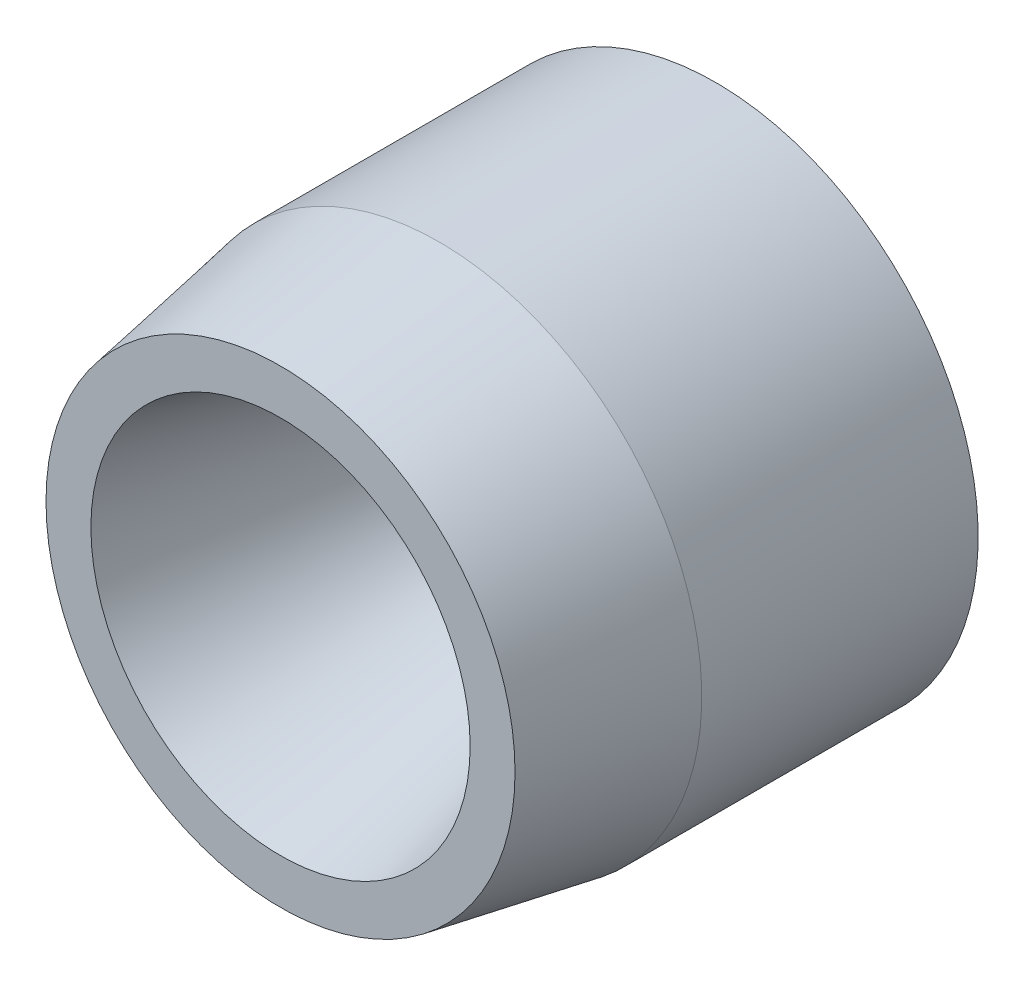
ISO-10303-21;
HEADER;
FILE_DESCRIPTION(('STEP AP214'),'2;1');
FILE_NAME('part.step','',(''),(''),'','','');
FILE_SCHEMA(('AUTOMOTIVE_DESIGN { 1 0 10303 214 1 1 1 1 }'));
ENDSEC;
DATA;
#1=APPLICATION_CONTEXT('core data for automotive mechanical design processes');
#2=APPLICATION_PROTOCOL_DEFINITION('international standard','automotive_design',2000,#1);
#3=PRODUCT_CONTEXT('',#1,'mechanical');
#4=PRODUCT('Part','Part','',(#3));
#5=PRODUCT_RELATED_PRODUCT_CATEGORY('part','',(#4));
#6=PRODUCT_DEFINITION_FORMATION('','',#4);
#7=PRODUCT_DEFINITION_CONTEXT('part definition',#1,'design');
#8=PRODUCT_DEFINITION('design','',#6,#7);
#9=PRODUCT_DEFINITION_SHAPE('','',#8);
#10=(LENGTH_UNIT() NAMED_UNIT(*) SI_UNIT(.MILLI.,.METRE.));
#11=(NAMED_UNIT(*) PLANE_ANGLE_UNIT() SI_UNIT($,.RADIAN.));
#12=(NAMED_UNIT(*) SI_UNIT($,.STERADIAN.) SOLID_ANGLE_UNIT());
#13=UNCERTAINTY_MEASURE_WITH_UNIT(LENGTH_MEASURE(1.E-05),#10,'distance_accuracy_value','');
#14=(GEOMETRIC_REPRESENTATION_CONTEXT(3) GLOBAL_UNCERTAINTY_ASSIGNED_CONTEXT((#13)) GLOBAL_UNIT_ASSIGNED_CONTEXT((#10,
#11,#12)) REPRESENTATION_CONTEXT('',''));
#15=CARTESIAN_POINT('',(0.,0.,0.));
#16=DIRECTION('',(0.,0.,1.));
#17=DIRECTION('',(1.,0.,0.));
#18=AXIS2_PLACEMENT_3D('',#15,#16,#17);
#19=CARTESIAN_POINT('',(0.,0.,-147.178415470673));
#20=DIRECTION('',(0.,0.,-1.));
#21=DIRECTION('',(-1.,0.,0.));
#22=AXIS2_PLACEMENT_3D('',#19,#20,#21);
#23=CYLINDRICAL_SURFACE('',#22,18.415);
#24=CARTESIAN_POINT('',(0.,0.,-120.876544155011));
#25=DIRECTION('',(0.,0.,-1.));
#26=DIRECTION('',(-1.,0.,0.));
#27=AXIS2_PLACEMENT_3D('',#24,#25,#26);
#28=CIRCLE('',#27,18.415);
#29=CARTESIAN_POINT('',(-18.415,0.,-120.876544155011));
#30=VERTEX_POINT('',#29);
#31=EDGE_CURVE('E10',#30,#30,#28,.T.);
#32=ORIENTED_EDGE('',*,*,#31,.F.);
#33=EDGE_LOOP('',(#32));
#34=FACE_BOUND('',#33,.T.);
#35=CARTESIAN_POINT('',(0.,0.,-129.963013838753));
#36=DIRECTION('',(0.,0.,-1.));
#37=DIRECTION('',(-1.,0.,0.));
#38=AXIS2_PLACEMENT_3D('',#35,#36,#37);
#39=CIRCLE('',#38,18.415);
#40=CARTESIAN_POINT('',(-18.415,0.,-129.963013838753));
#41=VERTEX_POINT('',#40);
#42=EDGE_CURVE('E74',#41,#41,#39,.T.);
#43=ORIENTED_EDGE('',*,*,#42,.T.);
#44=EDGE_LOOP('',(#43));
#45=FACE_BOUND('',#44,.T.);
#46=ADVANCED_FACE('F43',(#34,#45),#23,.F.);
#47=CARTESIAN_POINT('',(0.,0.,-69.9008));
#48=DIRECTION('',(0.,0.,1.));
#49=DIRECTION('',(1.,0.,0.));
#50=AXIS2_PLACEMENT_3D('',#47,#48,#49);
#51=CONICAL_SURFACE('',#50,32.0739094799108,0.26179938779915);
#52=ORIENTED_EDGE('',*,*,#31,.T.);
#53=EDGE_LOOP('',(#52));
#54=FACE_BOUND('',#53,.T.);
#55=CARTESIAN_POINT('',(0.,0.,-69.9008));
#56=DIRECTION('',(0.,0.,-1.));
#57=DIRECTION('',(-1.,0.,0.));
#58=AXIS2_PLACEMENT_3D('',#55,#56,#57);
#59=CIRCLE('',#58,32.0739094799108);
#60=CARTESIAN_POINT('',(-32.0739094799108,0.,-69.9008));
#61=VERTEX_POINT('',#60);
#62=EDGE_CURVE('E50',#61,#61,#59,.T.);
#63=ORIENTED_EDGE('',*,*,#62,.F.);
#64=EDGE_LOOP('',(#63));
#65=FACE_BOUND('',#64,.T.);
#66=ADVANCED_FACE('F106',(#54,#65),#51,.F.);
#67=CARTESIAN_POINT('',(0.,0.,-69.9008));
#68=DIRECTION('',(0.,0.,-1.));
#69=DIRECTION('',(-1.,0.,0.));
#70=AXIS2_PLACEMENT_3D('',#67,#68,#69);
#71=PLANE('',#70);
#72=CARTESIAN_POINT('',(0.,0.,-69.9008));
#73=DIRECTION('',(0.,0.,-1.));
#74=DIRECTION('',(-1.,0.,0.));
#75=AXIS2_PLACEMENT_3D('',#72,#73,#74);
#76=CIRCLE('',#75,39.6648950376225);
#77=CARTESIAN_POINT('',(-39.6648950376225,0.,-69.9008));
#78=VERTEX_POINT('',#77);
#79=EDGE_CURVE('E55',#78,#78,#76,.T.);
#80=ORIENTED_EDGE('',*,*,#79,.F.);
#81=EDGE_LOOP('',(#80));
#82=FACE_BOUND('',#81,.T.);
#83=ORIENTED_EDGE('',*,*,#62,.T.);
#84=EDGE_LOOP('',(#83));
#85=FACE_BOUND('',#84,.T.);
#86=ADVANCED_FACE('F101',(#82,#85),#71,.F.);
#87=CARTESIAN_POINT('',(0.,0.,-69.9008));
#88=DIRECTION('',(0.,0.,-1.));
#89=DIRECTION('',(-1.,0.,0.));
#90=AXIS2_PLACEMENT_3D('',#87,#88,#89);
#91=CONICAL_SURFACE('',#90,39.6648950376225,0.174532925199433);
#92=CARTESIAN_POINT('',(0.,0.,-96.7503776616572));
#93=DIRECTION('',(0.,0.,-1.));
#94=DIRECTION('',(-1.,0.,0.));
#95=AXIS2_PLACEMENT_3D('',#92,#93,#94);
#96=CIRCLE('',#95,44.3992);
#97=CARTESIAN_POINT('',(-44.3992,0.,-96.7503776616572));
#98=VERTEX_POINT('',#97);
#99=EDGE_CURVE('E60',#98,#98,#96,.T.);
#100=ORIENTED_EDGE('',*,*,#99,.F.);
#101=EDGE_LOOP('',(#100));
#102=FACE_BOUND('',#101,.T.);
#103=ORIENTED_EDGE('',*,*,#79,.T.);
#104=EDGE_LOOP('',(#103));
#105=FACE_BOUND('',#104,.T.);
#106=ADVANCED_FACE('F95',(#102,#105),#91,.T.);
#107=CARTESIAN_POINT('',(0.,0.,-147.178415470673));
#108=DIRECTION('',(0.,0.,-1.));
#109=DIRECTION('',(-1.,0.,0.));
#110=AXIS2_PLACEMENT_3D('',#107,#108,#109);
#111=CYLINDRICAL_SURFACE('',#110,44.3992);
#112=CARTESIAN_POINT('',(0.,0.,-143.498529019688));
#113=DIRECTION('',(0.,0.,-1.));
#114=DIRECTION('',(-1.,0.,0.));
#115=AXIS2_PLACEMENT_3D('',#112,#113,#114);
#116=CIRCLE('',#115,44.3992);
#117=CARTESIAN_POINT('',(-44.3992,0.,-143.498529019688));
#118=VERTEX_POINT('',#117);
#119=EDGE_CURVE('E66',#118,#118,#116,.T.);
#120=ORIENTED_EDGE('',*,*,#119,.F.);
#121=EDGE_LOOP('',(#120));
#122=FACE_BOUND('',#121,.T.);
#123=ORIENTED_EDGE('',*,*,#99,.T.);
#124=EDGE_LOOP('',(#123));
#125=FACE_BOUND('',#124,.T.);
#126=ADVANCED_FACE('F89',(#122,#125),#111,.T.);
#127=CARTESIAN_POINT('',(0.,0.,-143.498529019688));
#128=DIRECTION('',(0.,0.,1.));
#129=DIRECTION('',(1.,0.,0.));
#130=AXIS2_PLACEMENT_3D('',#127,#128,#129);
#131=PLANE('',#130);
#132=CARTESIAN_POINT('',(0.,0.,-143.498529019688));
#133=DIRECTION('',(0.,0.,-1.));
#134=DIRECTION('',(-1.,0.,0.));
#135=AXIS2_PLACEMENT_3D('',#132,#133,#134);
#136=CIRCLE('',#135,41.8592);
#137=CARTESIAN_POINT('',(-41.8592,0.,-143.498529019688));
#138=VERTEX_POINT('',#137);
#139=EDGE_CURVE('E70',#138,#138,#136,.T.);
#140=ORIENTED_EDGE('',*,*,#139,.F.);
#141=EDGE_LOOP('',(#140));
#142=FACE_BOUND('',#141,.T.);
#143=ORIENTED_EDGE('',*,*,#119,.T.);
#144=EDGE_LOOP('',(#143));
#145=FACE_BOUND('',#144,.T.);
#146=ADVANCED_FACE('F83',(#142,#145),#131,.F.);
#147=CARTESIAN_POINT('',(0.,0.,-143.498529019688));
#148=DIRECTION('',(0.,0.,-1.));
#149=DIRECTION('',(-1.,0.,0.));
#150=AXIS2_PLACEMENT_3D('',#147,#148,#149);
#151=CONICAL_SURFACE('',#150,41.8592,1.0471975511966);
#152=ORIENTED_EDGE('',*,*,#42,.F.);
#153=EDGE_LOOP('',(#152));
#154=FACE_BOUND('',#153,.T.);
#155=ORIENTED_EDGE('',*,*,#139,.T.);
#156=EDGE_LOOP('',(#155));
#157=FACE_BOUND('',#156,.T.);
#158=ADVANCED_FACE('F80',(#154,#157),#151,.F.);
#159=CLOSED_SHELL('',(#46,#66,#86,#106,#126,#146,#158));
#160=MANIFOLD_SOLID_BREP('B2',#159);
#161=ADVANCED_BREP_SHAPE_REPRESENTATION('',(#18,#160),#14);
#162=SHAPE_DEFINITION_REPRESENTATION(#9,#161);
ENDSEC;
END-ISO-10303-21;
